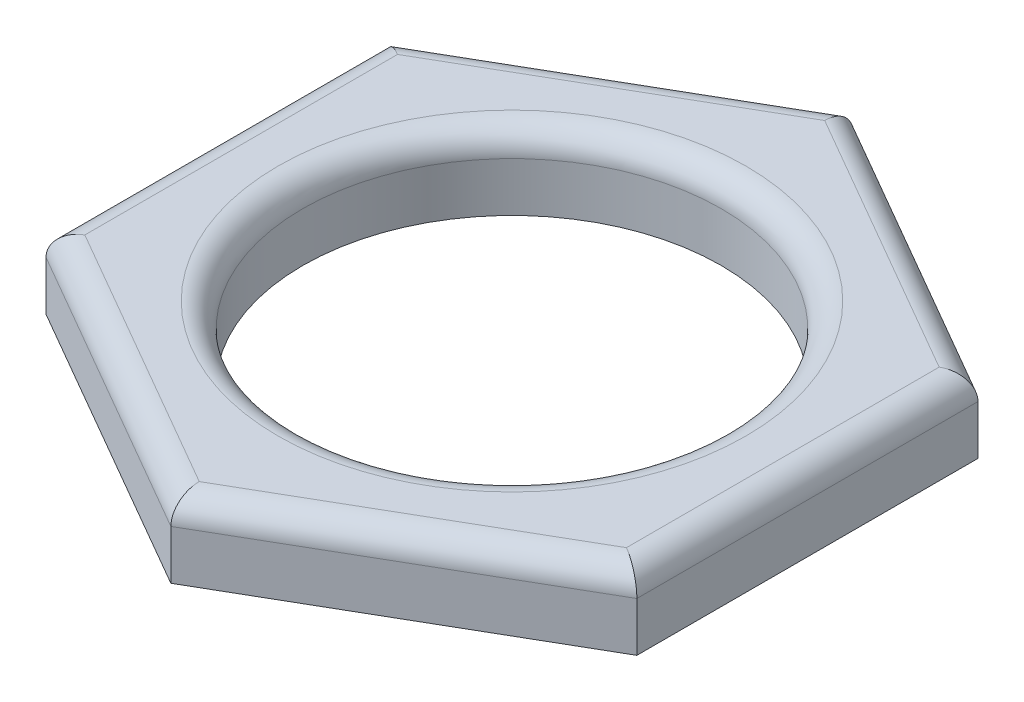
ISO-10303-21;
HEADER;
FILE_DESCRIPTION(('STEP AP214'),'2;1');
FILE_NAME('part.step','',(''),(''),'','','');
FILE_SCHEMA(('AUTOMOTIVE_DESIGN { 1 0 10303 214 1 1 1 1 }'));
ENDSEC;
DATA;
#1=APPLICATION_CONTEXT('core data for automotive mechanical design processes');
#2=APPLICATION_PROTOCOL_DEFINITION('international standard','automotive_design',2000,#1);
#3=PRODUCT_CONTEXT('',#1,'mechanical');
#4=PRODUCT('Part','Part','',(#3));
#5=PRODUCT_RELATED_PRODUCT_CATEGORY('part','',(#4));
#6=PRODUCT_DEFINITION_FORMATION('','',#4);
#7=PRODUCT_DEFINITION_CONTEXT('part definition',#1,'design');
#8=PRODUCT_DEFINITION('design','',#6,#7);
#9=PRODUCT_DEFINITION_SHAPE('','',#8);
#10=(LENGTH_UNIT() NAMED_UNIT(*) SI_UNIT(.MILLI.,.METRE.));
#11=(NAMED_UNIT(*) PLANE_ANGLE_UNIT() SI_UNIT($,.RADIAN.));
#12=(NAMED_UNIT(*) SI_UNIT($,.STERADIAN.) SOLID_ANGLE_UNIT());
#13=UNCERTAINTY_MEASURE_WITH_UNIT(LENGTH_MEASURE(1.E-05),#10,'distance_accuracy_value','');
#14=(GEOMETRIC_REPRESENTATION_CONTEXT(3) GLOBAL_UNCERTAINTY_ASSIGNED_CONTEXT((#13)) GLOBAL_UNIT_ASSIGNED_CONTEXT((#10,
#11,#12)) REPRESENTATION_CONTEXT('',''));
#15=CARTESIAN_POINT('',(0.,0.,0.));
#16=DIRECTION('',(0.,0.,1.));
#17=DIRECTION('',(1.,0.,0.));
#18=AXIS2_PLACEMENT_3D('',#15,#16,#17);
#19=CARTESIAN_POINT('',(0.,3.,0.));
#20=DIRECTION('',(0.,1.,0.));
#21=DIRECTION('',(0.,0.,1.));
#22=AXIS2_PLACEMENT_3D('',#19,#20,#21);
#23=PLANE('',#22);
#24=CARTESIAN_POINT('',(0.,3.,0.));
#25=DIRECTION('',(0.,1.,0.));
#26=DIRECTION('',(0.,0.,1.));
#27=AXIS2_PLACEMENT_3D('',#24,#25,#26);
#28=CIRCLE('',#27,9.5);
#29=CARTESIAN_POINT('',(0.,3.,9.5));
#30=VERTEX_POINT('',#29);
#31=EDGE_CURVE('E167',#30,#30,#28,.F.);
#32=ORIENTED_EDGE('',*,*,#31,.T.);
#33=EDGE_LOOP('',(#32));
#34=FACE_BOUND('',#33,.T.);
#35=DIRECTION('',(0.866025403784439,0.,-0.5));
#36=VECTOR('',#35,1.);
#37=CARTESIAN_POINT('',(11.5,3.,6.06217782649109));
#38=LINE('',#37,#36);
#39=CARTESIAN_POINT('',(0.,3.,12.7017059221718));
#40=VERTEX_POINT('',#39);
#41=CARTESIAN_POINT('',(11.,3.,6.35085296108591));
#42=VERTEX_POINT('',#41);
#43=EDGE_CURVE('E162',#40,#42,#38,.T.);
#44=ORIENTED_EDGE('',*,*,#43,.T.);
#45=DIRECTION('',(0.,0.,-1.));
#46=VECTOR('',#45,1.);
#47=CARTESIAN_POINT('',(11.,3.,-6.92820323027553));
#48=LINE('',#47,#46);
#49=CARTESIAN_POINT('',(11.,3.,-6.3508529610859));
#50=VERTEX_POINT('',#49);
#51=EDGE_CURVE('E164',#42,#50,#48,.T.);
#52=ORIENTED_EDGE('',*,*,#51,.T.);
#53=DIRECTION('',(-0.866025403784439,0.,-0.5));
#54=VECTOR('',#53,1.);
#55=CARTESIAN_POINT('',(-0.500000000000007,3.,-12.9903810567666));
#56=LINE('',#55,#54);
#57=CARTESIAN_POINT('',(0.,3.,-12.7017059221718));
#58=VERTEX_POINT('',#57);
#59=EDGE_CURVE('E154',#50,#58,#56,.T.);
#60=ORIENTED_EDGE('',*,*,#59,.T.);
#61=DIRECTION('',(-0.866025403784439,0.,0.5));
#62=VECTOR('',#61,1.);
#63=CARTESIAN_POINT('',(-11.5,3.,-6.06217782649108));
#64=LINE('',#63,#62);
#65=CARTESIAN_POINT('',(-11.,3.,-6.35085296108589));
#66=VERTEX_POINT('',#65);
#67=EDGE_CURVE('E156',#58,#66,#64,.T.);
#68=ORIENTED_EDGE('',*,*,#67,.T.);
#69=DIRECTION('',(0.,0.,1.));
#70=VECTOR('',#69,1.);
#71=CARTESIAN_POINT('',(-11.,3.,6.92820323027551));
#72=LINE('',#71,#70);
#73=CARTESIAN_POINT('',(-11.,3.,6.35085296108588));
#74=VERTEX_POINT('',#73);
#75=EDGE_CURVE('E158',#66,#74,#72,.T.);
#76=ORIENTED_EDGE('',*,*,#75,.T.);
#77=DIRECTION('',(0.866025403784439,0.,0.5));
#78=VECTOR('',#77,1.);
#79=CARTESIAN_POINT('',(0.500000000000016,3.,12.9903810567666));
#80=LINE('',#79,#78);
#81=EDGE_CURVE('E160',#74,#40,#80,.T.);
#82=ORIENTED_EDGE('',*,*,#81,.T.);
#83=EDGE_LOOP('',(#44,#52,#60,#68,#76,#82));
#84=FACE_BOUND('',#83,.T.);
#85=ADVANCED_FACE('F35',(#34,#84),#23,.T.);
#86=CARTESIAN_POINT('',(0.,0.,0.));
#87=DIRECTION('',(0.,1.,0.));
#88=DIRECTION('',(0.,0.,1.));
#89=AXIS2_PLACEMENT_3D('',#86,#87,#88);
#90=PLANE('',#89);
#91=DIRECTION('',(-0.866025403784439,0.,-0.5));
#92=VECTOR('',#91,1.);
#93=CARTESIAN_POINT('',(12.,0.,-6.92820323027553));
#94=LINE('',#93,#92);
#95=CARTESIAN_POINT('',(12.,0.,-6.92820323027553));
#96=VERTEX_POINT('',#95);
#97=CARTESIAN_POINT('',(0.,0.,-13.856406460551));
#98=VERTEX_POINT('',#97);
#99=EDGE_CURVE('E121',#96,#98,#94,.T.);
#100=ORIENTED_EDGE('',*,*,#99,.F.);
#101=DIRECTION('',(0.,0.,-1.));
#102=VECTOR('',#101,1.);
#103=CARTESIAN_POINT('',(12.,0.,6.92820323027553));
#104=LINE('',#103,#102);
#105=CARTESIAN_POINT('',(12.,0.,6.92820323027553));
#106=VERTEX_POINT('',#105);
#107=EDGE_CURVE('E142',#106,#96,#104,.T.);
#108=ORIENTED_EDGE('',*,*,#107,.F.);
#109=DIRECTION('',(0.866025403784439,0.,-0.5));
#110=VECTOR('',#109,1.);
#111=CARTESIAN_POINT('',(0.,0.,13.856406460551));
#112=LINE('',#111,#110);
#113=CARTESIAN_POINT('',(0.,0.,13.856406460551));
#114=VERTEX_POINT('',#113);
#115=EDGE_CURVE('E139',#114,#106,#112,.T.);
#116=ORIENTED_EDGE('',*,*,#115,.F.);
#117=DIRECTION('',(0.866025403784439,0.,0.5));
#118=VECTOR('',#117,1.);
#119=CARTESIAN_POINT('',(-12.,0.,6.92820323027551));
#120=LINE('',#119,#118);
#121=CARTESIAN_POINT('',(-12.,0.,6.92820323027551));
#122=VERTEX_POINT('',#121);
#123=EDGE_CURVE('E136',#122,#114,#120,.T.);
#124=ORIENTED_EDGE('',*,*,#123,.F.);
#125=DIRECTION('',(0.,0.,1.));
#126=VECTOR('',#125,1.);
#127=CARTESIAN_POINT('',(-12.,0.,-6.92820323027551));
#128=LINE('',#127,#126);
#129=CARTESIAN_POINT('',(-12.,0.,-6.92820323027551));
#130=VERTEX_POINT('',#129);
#131=EDGE_CURVE('E124',#130,#122,#128,.T.);
#132=ORIENTED_EDGE('',*,*,#131,.F.);
#133=DIRECTION('',(-0.866025403784438,0.,0.5));
#134=VECTOR('',#133,1.);
#135=CARTESIAN_POINT('',(0.,0.,-13.856406460551));
#136=LINE('',#135,#134);
#137=EDGE_CURVE('E108',#98,#130,#136,.T.);
#138=ORIENTED_EDGE('',*,*,#137,.F.);
#139=EDGE_LOOP('',(#100,#108,#116,#124,#132,#138));
#140=FACE_BOUND('',#139,.T.);
#141=CARTESIAN_POINT('',(0.,0.,0.));
#142=DIRECTION('',(0.,1.,0.));
#143=DIRECTION('',(0.,0.,1.));
#144=AXIS2_PLACEMENT_3D('',#141,#142,#143);
#145=CIRCLE('',#144,8.5);
#146=CARTESIAN_POINT('',(0.,0.,8.5));
#147=VERTEX_POINT('',#146);
#148=EDGE_CURVE('E130',#147,#147,#145,.T.);
#149=ORIENTED_EDGE('',*,*,#148,.T.);
#150=EDGE_LOOP('',(#149));
#151=FACE_BOUND('',#150,.T.);
#152=ADVANCED_FACE('F118',(#140,#151),#90,.F.);
#153=CARTESIAN_POINT('',(12.,3.,-6.92820323027553));
#154=DIRECTION('',(-0.5,0.,0.866025403784439));
#155=DIRECTION('',(0.866025403784439,0.,0.5));
#156=AXIS2_PLACEMENT_3D('',#153,#154,#155);
#157=PLANE('',#156);
#158=DIRECTION('',(0.,-1.,0.));
#159=VECTOR('',#158,1.);
#160=CARTESIAN_POINT('',(0.,3.,-13.856406460551));
#161=LINE('',#160,#159);
#162=CARTESIAN_POINT('',(0.,2.,-13.856406460551));
#163=VERTEX_POINT('',#162);
#164=EDGE_CURVE('E105',#163,#98,#161,.T.);
#165=ORIENTED_EDGE('',*,*,#164,.F.);
#166=DIRECTION('',(-0.866025403784439,0.,-0.5));
#167=VECTOR('',#166,1.);
#168=CARTESIAN_POINT('',(12.,2.,-6.92820323027553));
#169=LINE('',#168,#167);
#170=CARTESIAN_POINT('',(12.,2.,-6.92820323027553));
#171=VERTEX_POINT('',#170);
#172=EDGE_CURVE('E11',#163,#171,#169,.F.);
#173=ORIENTED_EDGE('',*,*,#172,.T.);
#174=DIRECTION('',(0.,-1.,0.));
#175=VECTOR('',#174,1.);
#176=CARTESIAN_POINT('',(12.,3.,-6.92820323027553));
#177=LINE('',#176,#175);
#178=EDGE_CURVE('E128',#171,#96,#177,.T.);
#179=ORIENTED_EDGE('',*,*,#178,.T.);
#180=ORIENTED_EDGE('',*,*,#99,.T.);
#181=EDGE_LOOP('',(#165,#173,#179,#180));
#182=FACE_BOUND('',#181,.T.);
#183=ADVANCED_FACE('F126',(#182),#157,.F.);
#184=CARTESIAN_POINT('',(0.,3.,-13.856406460551));
#185=DIRECTION('',(0.5,0.,0.866025403784439));
#186=DIRECTION('',(0.866025403784439,0.,-0.5));
#187=AXIS2_PLACEMENT_3D('',#184,#185,#186);
#188=PLANE('',#187);
#189=DIRECTION('',(0.,-1.,0.));
#190=VECTOR('',#189,1.);
#191=CARTESIAN_POINT('',(-12.,3.,-6.92820323027551));
#192=LINE('',#191,#190);
#193=CARTESIAN_POINT('',(-12.,2.,-6.92820323027551));
#194=VERTEX_POINT('',#193);
#195=EDGE_CURVE('E114',#194,#130,#192,.T.);
#196=ORIENTED_EDGE('',*,*,#195,.F.);
#197=DIRECTION('',(-0.866025403784439,0.,0.5));
#198=VECTOR('',#197,1.);
#199=CARTESIAN_POINT('',(0.,2.,-13.856406460551));
#200=LINE('',#199,#198);
#201=EDGE_CURVE('E44',#194,#163,#200,.F.);
#202=ORIENTED_EDGE('',*,*,#201,.T.);
#203=ORIENTED_EDGE('',*,*,#164,.T.);
#204=ORIENTED_EDGE('',*,*,#137,.T.);
#205=EDGE_LOOP('',(#196,#202,#203,#204));
#206=FACE_BOUND('',#205,.T.);
#207=ADVANCED_FACE('F107',(#206),#188,.F.);
#208=CARTESIAN_POINT('',(-12.,3.,-6.92820323027551));
#209=DIRECTION('',(1.,0.,0.));
#210=DIRECTION('',(0.,0.,-1.));
#211=AXIS2_PLACEMENT_3D('',#208,#209,#210);
#212=PLANE('',#211);
#213=DIRECTION('',(0.,-1.,0.));
#214=VECTOR('',#213,1.);
#215=CARTESIAN_POINT('',(-12.,3.,6.92820323027551));
#216=LINE('',#215,#214);
#217=CARTESIAN_POINT('',(-12.,2.,6.92820323027551));
#218=VERTEX_POINT('',#217);
#219=EDGE_CURVE('E149',#218,#122,#216,.T.);
#220=ORIENTED_EDGE('',*,*,#219,.F.);
#221=DIRECTION('',(0.,0.,1.));
#222=VECTOR('',#221,1.);
#223=CARTESIAN_POINT('',(-12.,2.,-6.92820323027551));
#224=LINE('',#223,#222);
#225=EDGE_CURVE('E59',#218,#194,#224,.F.);
#226=ORIENTED_EDGE('',*,*,#225,.T.);
#227=ORIENTED_EDGE('',*,*,#195,.T.);
#228=ORIENTED_EDGE('',*,*,#131,.T.);
#229=EDGE_LOOP('',(#220,#226,#227,#228));
#230=FACE_BOUND('',#229,.T.);
#231=ADVANCED_FACE('F226',(#230),#212,.F.);
#232=CARTESIAN_POINT('',(-12.,3.,6.92820323027551));
#233=DIRECTION('',(0.5,0.,-0.866025403784439));
#234=DIRECTION('',(-0.866025403784439,0.,-0.5));
#235=AXIS2_PLACEMENT_3D('',#232,#233,#234);
#236=PLANE('',#235);
#237=DIRECTION('',(0.,-1.,0.));
#238=VECTOR('',#237,1.);
#239=CARTESIAN_POINT('',(0.,3.,13.856406460551));
#240=LINE('',#239,#238);
#241=CARTESIAN_POINT('',(0.,2.,13.856406460551));
#242=VERTEX_POINT('',#241);
#243=EDGE_CURVE('E147',#242,#114,#240,.T.);
#244=ORIENTED_EDGE('',*,*,#243,.F.);
#245=DIRECTION('',(0.866025403784439,0.,0.5));
#246=VECTOR('',#245,1.);
#247=CARTESIAN_POINT('',(-12.,2.,6.92820323027551));
#248=LINE('',#247,#246);
#249=EDGE_CURVE('E175',#242,#218,#248,.F.);
#250=ORIENTED_EDGE('',*,*,#249,.T.);
#251=ORIENTED_EDGE('',*,*,#219,.T.);
#252=ORIENTED_EDGE('',*,*,#123,.T.);
#253=EDGE_LOOP('',(#244,#250,#251,#252));
#254=FACE_BOUND('',#253,.T.);
#255=ADVANCED_FACE('F224',(#254),#236,.F.);
#256=CARTESIAN_POINT('',(0.,3.,13.856406460551));
#257=DIRECTION('',(-0.5,0.,-0.866025403784439));
#258=DIRECTION('',(-0.866025403784439,0.,0.5));
#259=AXIS2_PLACEMENT_3D('',#256,#257,#258);
#260=PLANE('',#259);
#261=DIRECTION('',(0.,-1.,0.));
#262=VECTOR('',#261,1.);
#263=CARTESIAN_POINT('',(12.,3.,6.92820323027553));
#264=LINE('',#263,#262);
#265=CARTESIAN_POINT('',(12.,2.,6.92820323027553));
#266=VERTEX_POINT('',#265);
#267=EDGE_CURVE('E145',#266,#106,#264,.T.);
#268=ORIENTED_EDGE('',*,*,#267,.F.);
#269=DIRECTION('',(0.866025403784439,0.,-0.5));
#270=VECTOR('',#269,1.);
#271=CARTESIAN_POINT('',(0.,2.,13.856406460551));
#272=LINE('',#271,#270);
#273=EDGE_CURVE('E173',#266,#242,#272,.F.);
#274=ORIENTED_EDGE('',*,*,#273,.T.);
#275=ORIENTED_EDGE('',*,*,#243,.T.);
#276=ORIENTED_EDGE('',*,*,#115,.T.);
#277=EDGE_LOOP('',(#268,#274,#275,#276));
#278=FACE_BOUND('',#277,.T.);
#279=ADVANCED_FACE('F222',(#278),#260,.F.);
#280=CARTESIAN_POINT('',(12.,3.,6.92820323027553));
#281=DIRECTION('',(-1.,0.,0.));
#282=DIRECTION('',(0.,0.,1.));
#283=AXIS2_PLACEMENT_3D('',#280,#281,#282);
#284=PLANE('',#283);
#285=ORIENTED_EDGE('',*,*,#178,.F.);
#286=DIRECTION('',(0.,0.,-1.));
#287=VECTOR('',#286,1.);
#288=CARTESIAN_POINT('',(12.,2.,6.92820323027553));
#289=LINE('',#288,#287);
#290=EDGE_CURVE('E170',#171,#266,#289,.F.);
#291=ORIENTED_EDGE('',*,*,#290,.T.);
#292=ORIENTED_EDGE('',*,*,#267,.T.);
#293=ORIENTED_EDGE('',*,*,#107,.T.);
#294=EDGE_LOOP('',(#285,#291,#292,#293));
#295=FACE_BOUND('',#294,.T.);
#296=ADVANCED_FACE('F210',(#295),#284,.F.);
#297=CARTESIAN_POINT('',(0.,3.,0.));
#298=DIRECTION('',(0.,-1.,0.));
#299=DIRECTION('',(0.,0.,-1.));
#300=AXIS2_PLACEMENT_3D('',#297,#298,#299);
#301=CYLINDRICAL_SURFACE('',#300,8.5);
#302=CARTESIAN_POINT('',(0.,2.,0.));
#303=DIRECTION('',(0.,1.,0.));
#304=DIRECTION('',(0.,0.,1.));
#305=AXIS2_PLACEMENT_3D('',#302,#303,#304);
#306=CIRCLE('',#305,8.5);
#307=CARTESIAN_POINT('',(0.,2.,8.5));
#308=VERTEX_POINT('',#307);
#309=EDGE_CURVE('E113',#308,#308,#306,.T.);
#310=ORIENTED_EDGE('',*,*,#309,.T.);
#311=EDGE_LOOP('',(#310));
#312=FACE_BOUND('',#311,.T.);
#313=ORIENTED_EDGE('',*,*,#148,.F.);
#314=EDGE_LOOP('',(#313));
#315=FACE_BOUND('',#314,.T.);
#316=ADVANCED_FACE('F244',(#312,#315),#301,.F.);
#317=CARTESIAN_POINT('',(0.,2.,0.));
#318=DIRECTION('',(0.,1.,0.));
#319=DIRECTION('',(0.,0.,1.));
#320=AXIS2_PLACEMENT_3D('',#317,#318,#319);
#321=TOROIDAL_SURFACE('',#320,9.5,1.);
#322=ORIENTED_EDGE('',*,*,#31,.F.);
#323=EDGE_LOOP('',(#322));
#324=FACE_BOUND('',#323,.T.);
#325=ORIENTED_EDGE('',*,*,#309,.F.);
#326=EDGE_LOOP('',(#325));
#327=FACE_BOUND('',#326,.T.);
#328=ADVANCED_FACE('F263',(#324,#327),#321,.T.);
#329=CARTESIAN_POINT('',(-11.,2.,0.));
#330=DIRECTION('',(0.,0.,-1.));
#331=DIRECTION('',(-1.,0.,0.));
#332=AXIS2_PLACEMENT_3D('',#329,#330,#331);
#333=CYLINDRICAL_SURFACE('',#332,1.);
#334=CARTESIAN_POINT('',(-11.,2.,-6.35085296108589));
#335=DIRECTION('',(0.5,0.,-0.866025403784439));
#336=DIRECTION('',(0.866025403784439,0.,0.5));
#337=AXIS2_PLACEMENT_3D('',#334,#335,#336);
#338=ELLIPSE('',#337,1.15470053837925,1.);
#339=EDGE_CURVE('E188',#194,#66,#338,.T.);
#340=ORIENTED_EDGE('',*,*,#339,.F.);
#341=ORIENTED_EDGE('',*,*,#225,.F.);
#342=CARTESIAN_POINT('',(-11.,2.,6.35085296108588));
#343=DIRECTION('',(-0.5,0.,-0.866025403784438));
#344=DIRECTION('',(0.866025403784439,0.,-0.5));
#345=AXIS2_PLACEMENT_3D('',#342,#343,#344);
#346=ELLIPSE('',#345,1.15470053837925,1.);
#347=EDGE_CURVE('E39',#74,#218,#346,.F.);
#348=ORIENTED_EDGE('',*,*,#347,.F.);
#349=ORIENTED_EDGE('',*,*,#75,.F.);
#350=EDGE_LOOP('',(#340,#341,#348,#349));
#351=FACE_BOUND('',#350,.T.);
#352=ADVANCED_FACE('F37',(#351),#333,.T.);
#353=CARTESIAN_POINT('',(-5.5,2.,9.52627944162882));
#354=DIRECTION('',(-0.866025403784439,0.,-0.5));
#355=DIRECTION('',(-0.5,0.,0.866025403784439));
#356=AXIS2_PLACEMENT_3D('',#353,#354,#355);
#357=CYLINDRICAL_SURFACE('',#356,1.);
#358=ORIENTED_EDGE('',*,*,#347,.T.);
#359=ORIENTED_EDGE('',*,*,#249,.F.);
#360=CARTESIAN_POINT('',(0.,2.,12.7017059221718));
#361=DIRECTION('',(-1.,0.,0.));
#362=DIRECTION('',(0.,0.,-1.));
#363=AXIS2_PLACEMENT_3D('',#360,#361,#362);
#364=ELLIPSE('',#363,1.15470053837925,1.);
#365=EDGE_CURVE('E186',#40,#242,#364,.F.);
#366=ORIENTED_EDGE('',*,*,#365,.F.);
#367=ORIENTED_EDGE('',*,*,#81,.F.);
#368=EDGE_LOOP('',(#358,#359,#366,#367));
#369=FACE_BOUND('',#368,.T.);
#370=ADVANCED_FACE('F198',(#369),#357,.T.);
#371=CARTESIAN_POINT('',(-5.50000000000001,2.,-9.52627944162883));
#372=DIRECTION('',(0.866025403784439,0.,-0.5));
#373=DIRECTION('',(-0.5,0.,-0.866025403784439));
#374=AXIS2_PLACEMENT_3D('',#371,#372,#373);
#375=CYLINDRICAL_SURFACE('',#374,1.);
#376=ORIENTED_EDGE('',*,*,#339,.T.);
#377=ORIENTED_EDGE('',*,*,#67,.F.);
#378=CARTESIAN_POINT('',(0.,2.,-12.7017059221718));
#379=DIRECTION('',(1.,0.,0.));
#380=DIRECTION('',(0.,0.,1.));
#381=AXIS2_PLACEMENT_3D('',#378,#379,#380);
#382=ELLIPSE('',#381,1.15470053837925,1.);
#383=EDGE_CURVE('E183',#163,#58,#382,.T.);
#384=ORIENTED_EDGE('',*,*,#383,.F.);
#385=ORIENTED_EDGE('',*,*,#201,.F.);
#386=EDGE_LOOP('',(#376,#377,#384,#385));
#387=FACE_BOUND('',#386,.T.);
#388=ADVANCED_FACE('F202',(#387),#375,.T.);
#389=CARTESIAN_POINT('',(5.5,2.,9.52627944162883));
#390=DIRECTION('',(-0.866025403784439,0.,0.5));
#391=DIRECTION('',(0.5,0.,0.866025403784439));
#392=AXIS2_PLACEMENT_3D('',#389,#390,#391);
#393=CYLINDRICAL_SURFACE('',#392,1.);
#394=ORIENTED_EDGE('',*,*,#365,.T.);
#395=ORIENTED_EDGE('',*,*,#273,.F.);
#396=CARTESIAN_POINT('',(11.,2.,6.3508529610859));
#397=DIRECTION('',(-0.5,0.,0.866025403784439));
#398=DIRECTION('',(-0.866025403784439,0.,-0.5));
#399=AXIS2_PLACEMENT_3D('',#396,#397,#398);
#400=ELLIPSE('',#399,1.15470053837925,1.);
#401=EDGE_CURVE('E181',#42,#266,#400,.F.);
#402=ORIENTED_EDGE('',*,*,#401,.F.);
#403=ORIENTED_EDGE('',*,*,#43,.F.);
#404=EDGE_LOOP('',(#394,#395,#402,#403));
#405=FACE_BOUND('',#404,.T.);
#406=ADVANCED_FACE('F219',(#405),#393,.T.);
#407=CARTESIAN_POINT('',(5.5,2.,-9.52627944162883));
#408=DIRECTION('',(0.866025403784439,0.,0.5));
#409=DIRECTION('',(0.5,0.,-0.866025403784439));
#410=AXIS2_PLACEMENT_3D('',#407,#408,#409);
#411=CYLINDRICAL_SURFACE('',#410,1.);
#412=ORIENTED_EDGE('',*,*,#383,.T.);
#413=ORIENTED_EDGE('',*,*,#59,.F.);
#414=CARTESIAN_POINT('',(11.,2.,-6.3508529610859));
#415=DIRECTION('',(0.5,0.,0.866025403784438));
#416=DIRECTION('',(0.866025403784438,0.,-0.5));
#417=AXIS2_PLACEMENT_3D('',#414,#415,#416);
#418=ELLIPSE('',#417,1.15470053837925,1.);
#419=EDGE_CURVE('E179',#171,#50,#418,.T.);
#420=ORIENTED_EDGE('',*,*,#419,.F.);
#421=ORIENTED_EDGE('',*,*,#172,.F.);
#422=EDGE_LOOP('',(#412,#413,#420,#421));
#423=FACE_BOUND('',#422,.T.);
#424=ADVANCED_FACE('F207',(#423),#411,.T.);
#425=CARTESIAN_POINT('',(11.,2.,0.));
#426=DIRECTION('',(0.,0.,1.));
#427=DIRECTION('',(1.,0.,0.));
#428=AXIS2_PLACEMENT_3D('',#425,#426,#427);
#429=CYLINDRICAL_SURFACE('',#428,1.);
#430=ORIENTED_EDGE('',*,*,#401,.T.);
#431=ORIENTED_EDGE('',*,*,#290,.F.);
#432=ORIENTED_EDGE('',*,*,#419,.T.);
#433=ORIENTED_EDGE('',*,*,#51,.F.);
#434=EDGE_LOOP('',(#430,#431,#432,#433));
#435=FACE_BOUND('',#434,.T.);
#436=ADVANCED_FACE('F213',(#435),#429,.T.);
#437=CLOSED_SHELL('',(#85,#152,#183,#207,#231,#255,#279,#296,#316,#328,#352,#370,#388,#406,#424,#436));
#438=MANIFOLD_SOLID_BREP('B2',#437);
#439=ADVANCED_BREP_SHAPE_REPRESENTATION('',(#18,#438),#14);
#440=SHAPE_DEFINITION_REPRESENTATION(#9,#439);
ENDSEC;
END-ISO-10303-21;
